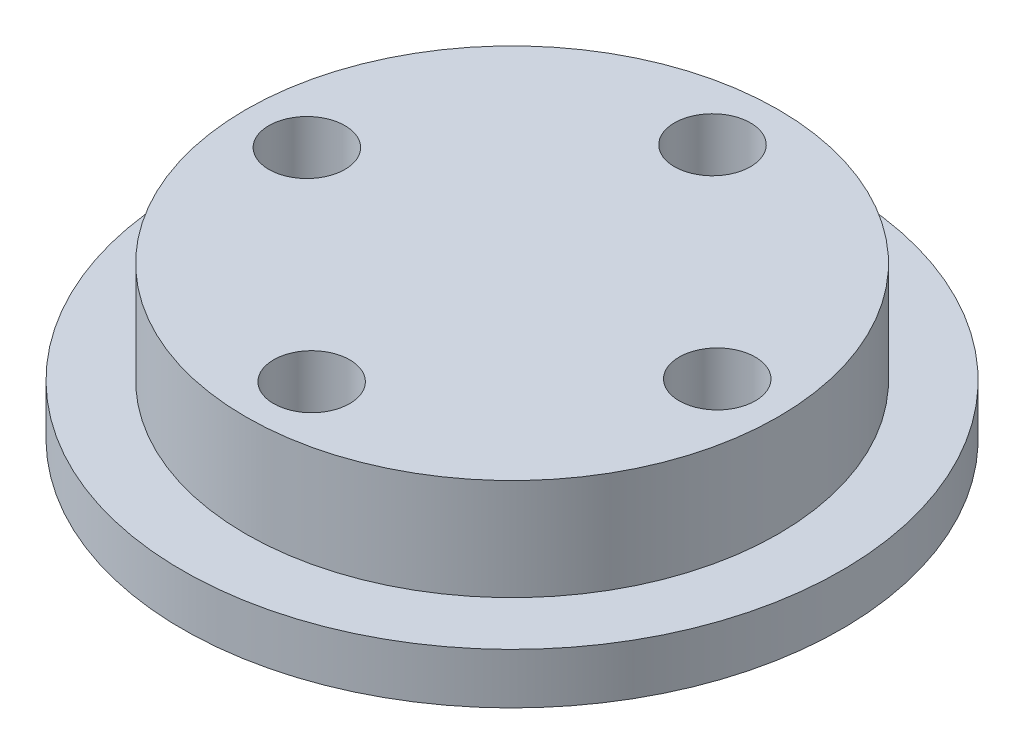
ISO-10303-21;
HEADER;
FILE_DESCRIPTION(('STEP AP214'),'2;1');
FILE_NAME('part.step','',(''),(''),'','','');
FILE_SCHEMA(('AUTOMOTIVE_DESIGN { 1 0 10303 214 1 1 1 1 }'));
ENDSEC;
DATA;
#1=APPLICATION_CONTEXT('core data for automotive mechanical design processes');
#2=APPLICATION_PROTOCOL_DEFINITION('international standard','automotive_design',2000,#1);
#3=PRODUCT_CONTEXT('',#1,'mechanical');
#4=PRODUCT('Part','Part','',(#3));
#5=PRODUCT_RELATED_PRODUCT_CATEGORY('part','',(#4));
#6=PRODUCT_DEFINITION_FORMATION('','',#4);
#7=PRODUCT_DEFINITION_CONTEXT('part definition',#1,'design');
#8=PRODUCT_DEFINITION('design','',#6,#7);
#9=PRODUCT_DEFINITION_SHAPE('','',#8);
#10=(LENGTH_UNIT() NAMED_UNIT(*) SI_UNIT(.MILLI.,.METRE.));
#11=(NAMED_UNIT(*) PLANE_ANGLE_UNIT() SI_UNIT($,.RADIAN.));
#12=(NAMED_UNIT(*) SI_UNIT($,.STERADIAN.) SOLID_ANGLE_UNIT());
#13=UNCERTAINTY_MEASURE_WITH_UNIT(LENGTH_MEASURE(1.E-05),#10,'distance_accuracy_value','');
#14=(GEOMETRIC_REPRESENTATION_CONTEXT(3) GLOBAL_UNCERTAINTY_ASSIGNED_CONTEXT((#13)) GLOBAL_UNIT_ASSIGNED_CONTEXT((#10,
#11,#12)) REPRESENTATION_CONTEXT('',''));
#15=CARTESIAN_POINT('',(0.,0.,0.));
#16=DIRECTION('',(0.,0.,1.));
#17=DIRECTION('',(1.,0.,0.));
#18=AXIS2_PLACEMENT_3D('',#15,#16,#17);
#19=CARTESIAN_POINT('',(0.,4.,0.));
#20=DIRECTION('',(0.,-1.,0.));
#21=DIRECTION('',(0.,0.,-1.));
#22=AXIS2_PLACEMENT_3D('',#19,#20,#21);
#23=CYLINDRICAL_SURFACE('',#22,10.5);
#24=CARTESIAN_POINT('',(0.,4.,0.));
#25=DIRECTION('',(0.,1.,0.));
#26=DIRECTION('',(0.,0.,1.));
#27=AXIS2_PLACEMENT_3D('',#24,#25,#26);
#28=CIRCLE('',#27,10.5);
#29=CARTESIAN_POINT('',(0.,4.,10.5));
#30=VERTEX_POINT('',#29);
#31=EDGE_CURVE('E10',#30,#30,#28,.T.);
#32=ORIENTED_EDGE('',*,*,#31,.F.);
#33=EDGE_LOOP('',(#32));
#34=FACE_BOUND('',#33,.T.);
#35=CARTESIAN_POINT('',(0.,0.,0.));
#36=DIRECTION('',(0.,-1.,0.));
#37=DIRECTION('',(0.,0.,-1.));
#38=AXIS2_PLACEMENT_3D('',#35,#36,#37);
#39=CIRCLE('',#38,10.5);
#40=CARTESIAN_POINT('',(0.,0.,-10.5));
#41=VERTEX_POINT('',#40);
#42=EDGE_CURVE('E41',#41,#41,#39,.T.);
#43=ORIENTED_EDGE('',*,*,#42,.F.);
#44=EDGE_LOOP('',(#43));
#45=FACE_BOUND('',#44,.T.);
#46=ADVANCED_FACE('F35',(#34,#45),#23,.T.);
#47=CARTESIAN_POINT('',(0.,4.,0.));
#48=DIRECTION('',(0.,1.,0.));
#49=DIRECTION('',(0.,0.,1.));
#50=AXIS2_PLACEMENT_3D('',#47,#48,#49);
#51=PLANE('',#50);
#52=CARTESIAN_POINT('',(7.99944720738013,4.,-0.0940445444378522));
#53=DIRECTION('',(0.,1.,0.));
#54=DIRECTION('',(0.,0.,1.));
#55=AXIS2_PLACEMENT_3D('',#52,#53,#54);
#56=CIRCLE('',#55,1.49999999986292);
#57=CARTESIAN_POINT('',(7.99944720738013,4.,1.40595545542506));
#58=VERTEX_POINT('',#57);
#59=EDGE_CURVE('E73',#58,#58,#56,.T.);
#60=ORIENTED_EDGE('',*,*,#59,.F.);
#61=EDGE_LOOP('',(#60));
#62=FACE_BOUND('',#61,.T.);
#63=CARTESIAN_POINT('',(0.0940445444663485,4.,7.99944720740785));
#64=DIRECTION('',(0.,1.,0.));
#65=DIRECTION('',(0.,0.,1.));
#66=AXIS2_PLACEMENT_3D('',#63,#64,#65);
#67=CIRCLE('',#66,1.49999999999886);
#68=CARTESIAN_POINT('',(0.0940445444663485,4.,9.49944720740672));
#69=VERTEX_POINT('',#68);
#70=EDGE_CURVE('E67',#69,#69,#67,.T.);
#71=ORIENTED_EDGE('',*,*,#70,.F.);
#72=EDGE_LOOP('',(#71));
#73=FACE_BOUND('',#72,.T.);
#74=CARTESIAN_POINT('',(-0.0940445444656633,4.,-7.99944720735171));
#75=DIRECTION('',(0.,1.,0.));
#76=DIRECTION('',(0.,0.,1.));
#77=AXIS2_PLACEMENT_3D('',#74,#75,#76);
#78=CIRCLE('',#77,1.49999999999888);
#79=CARTESIAN_POINT('',(-0.0940445444656633,4.,-6.49944720735284));
#80=VERTEX_POINT('',#79);
#81=EDGE_CURVE('E61',#80,#80,#78,.T.);
#82=ORIENTED_EDGE('',*,*,#81,.F.);
#83=EDGE_LOOP('',(#82));
#84=FACE_BOUND('',#83,.T.);
#85=CARTESIAN_POINT('',(-7.99944720737944,4.,0.0940445444940485));
#86=DIRECTION('',(0.,1.,0.));
#87=DIRECTION('',(0.,0.,1.));
#88=AXIS2_PLACEMENT_3D('',#85,#86,#87);
#89=CIRCLE('',#88,1.49999999986292);
#90=CARTESIAN_POINT('',(-7.99944720737944,4.,1.59404454435697));
#91=VERTEX_POINT('',#90);
#92=EDGE_CURVE('E55',#91,#91,#89,.T.);
#93=ORIENTED_EDGE('',*,*,#92,.F.);
#94=EDGE_LOOP('',(#93));
#95=FACE_BOUND('',#94,.T.);
#96=ORIENTED_EDGE('',*,*,#31,.T.);
#97=EDGE_LOOP('',(#96));
#98=FACE_BOUND('',#97,.T.);
#99=ADVANCED_FACE('F89',(#62,#73,#84,#95,#98),#51,.T.);
#100=CARTESIAN_POINT('',(0.,0.,0.));
#101=DIRECTION('',(0.,-1.,0.));
#102=DIRECTION('',(0.,0.,-1.));
#103=AXIS2_PLACEMENT_3D('',#100,#101,#102);
#104=PLANE('',#103);
#105=CARTESIAN_POINT('',(0.,0.,0.));
#106=DIRECTION('',(0.,-1.,0.));
#107=DIRECTION('',(0.,0.,-1.));
#108=AXIS2_PLACEMENT_3D('',#105,#106,#107);
#109=CIRCLE('',#108,13.);
#110=CARTESIAN_POINT('',(0.,0.,-13.));
#111=VERTEX_POINT('',#110);
#112=EDGE_CURVE('E49',#111,#111,#109,.T.);
#113=ORIENTED_EDGE('',*,*,#112,.F.);
#114=EDGE_LOOP('',(#113));
#115=FACE_BOUND('',#114,.T.);
#116=ORIENTED_EDGE('',*,*,#42,.T.);
#117=EDGE_LOOP('',(#116));
#118=FACE_BOUND('',#117,.T.);
#119=ADVANCED_FACE('F92',(#115,#118),#104,.F.);
#120=CARTESIAN_POINT('',(0.,-2.,0.));
#121=DIRECTION('',(0.,1.,0.));
#122=DIRECTION('',(0.,0.,1.));
#123=AXIS2_PLACEMENT_3D('',#120,#121,#122);
#124=CYLINDRICAL_SURFACE('',#123,13.);
#125=CARTESIAN_POINT('',(0.,-2.,0.));
#126=DIRECTION('',(0.,-1.,0.));
#127=DIRECTION('',(0.,0.,-1.));
#128=AXIS2_PLACEMENT_3D('',#125,#126,#127);
#129=CIRCLE('',#128,13.);
#130=CARTESIAN_POINT('',(0.,-2.,-13.));
#131=VERTEX_POINT('',#130);
#132=EDGE_CURVE('E45',#131,#131,#129,.T.);
#133=ORIENTED_EDGE('',*,*,#132,.F.);
#134=EDGE_LOOP('',(#133));
#135=FACE_BOUND('',#134,.T.);
#136=ORIENTED_EDGE('',*,*,#112,.T.);
#137=EDGE_LOOP('',(#136));
#138=FACE_BOUND('',#137,.T.);
#139=ADVANCED_FACE('F110',(#135,#138),#124,.T.);
#140=CARTESIAN_POINT('',(0.,-2.,0.));
#141=DIRECTION('',(0.,-1.,0.));
#142=DIRECTION('',(0.,0.,-1.));
#143=AXIS2_PLACEMENT_3D('',#140,#141,#142);
#144=PLANE('',#143);
#145=CARTESIAN_POINT('',(7.99944720738013,-2.,-0.0940445444378522));
#146=DIRECTION('',(0.,1.,0.));
#147=DIRECTION('',(0.,0.,1.));
#148=AXIS2_PLACEMENT_3D('',#145,#146,#147);
#149=CIRCLE('',#148,1.49999999986292);
#150=CARTESIAN_POINT('',(7.99944720738013,-2.,1.40595545542506));
#151=VERTEX_POINT('',#150);
#152=EDGE_CURVE('E70',#151,#151,#149,.T.);
#153=ORIENTED_EDGE('',*,*,#152,.T.);
#154=EDGE_LOOP('',(#153));
#155=FACE_BOUND('',#154,.T.);
#156=CARTESIAN_POINT('',(0.0940445444663485,-2.,7.99944720740785));
#157=DIRECTION('',(0.,1.,0.));
#158=DIRECTION('',(0.,0.,1.));
#159=AXIS2_PLACEMENT_3D('',#156,#157,#158);
#160=CIRCLE('',#159,1.49999999999886);
#161=CARTESIAN_POINT('',(0.0940445444663485,-2.,9.49944720740672));
#162=VERTEX_POINT('',#161);
#163=EDGE_CURVE('E64',#162,#162,#160,.T.);
#164=ORIENTED_EDGE('',*,*,#163,.T.);
#165=EDGE_LOOP('',(#164));
#166=FACE_BOUND('',#165,.T.);
#167=CARTESIAN_POINT('',(-0.0940445444656633,-2.,-7.99944720735171));
#168=DIRECTION('',(0.,1.,0.));
#169=DIRECTION('',(0.,0.,1.));
#170=AXIS2_PLACEMENT_3D('',#167,#168,#169);
#171=CIRCLE('',#170,1.49999999999888);
#172=CARTESIAN_POINT('',(-0.0940445444656633,-2.,-6.49944720735284));
#173=VERTEX_POINT('',#172);
#174=EDGE_CURVE('E58',#173,#173,#171,.T.);
#175=ORIENTED_EDGE('',*,*,#174,.T.);
#176=EDGE_LOOP('',(#175));
#177=FACE_BOUND('',#176,.T.);
#178=CARTESIAN_POINT('',(-7.99944720737944,-2.,0.0940445444940485));
#179=DIRECTION('',(0.,1.,0.));
#180=DIRECTION('',(0.,0.,1.));
#181=AXIS2_PLACEMENT_3D('',#178,#179,#180);
#182=CIRCLE('',#181,1.49999999986292);
#183=CARTESIAN_POINT('',(-7.99944720737944,-2.,1.59404454435697));
#184=VERTEX_POINT('',#183);
#185=EDGE_CURVE('E53',#184,#184,#182,.T.);
#186=ORIENTED_EDGE('',*,*,#185,.T.);
#187=EDGE_LOOP('',(#186));
#188=FACE_BOUND('',#187,.T.);
#189=ORIENTED_EDGE('',*,*,#132,.T.);
#190=EDGE_LOOP('',(#189));
#191=FACE_BOUND('',#190,.T.);
#192=ADVANCED_FACE('F79',(#155,#166,#177,#188,#191),#144,.T.);
#193=CARTESIAN_POINT('',(-7.99944720737944,-2.,0.0940445444940485));
#194=DIRECTION('',(0.,1.,0.));
#195=DIRECTION('',(0.,0.,1.));
#196=AXIS2_PLACEMENT_3D('',#193,#194,#195);
#197=CYLINDRICAL_SURFACE('',#196,1.49999999986292);
#198=ORIENTED_EDGE('',*,*,#185,.F.);
#199=EDGE_LOOP('',(#198));
#200=FACE_BOUND('',#199,.T.);
#201=ORIENTED_EDGE('',*,*,#92,.T.);
#202=EDGE_LOOP('',(#201));
#203=FACE_BOUND('',#202,.T.);
#204=ADVANCED_FACE('F99',(#200,#203),#197,.F.);
#205=CARTESIAN_POINT('',(-0.0940445444656633,-2.,-7.99944720735171));
#206=DIRECTION('',(0.,1.,0.));
#207=DIRECTION('',(0.,0.,1.));
#208=AXIS2_PLACEMENT_3D('',#205,#206,#207);
#209=CYLINDRICAL_SURFACE('',#208,1.49999999999888);
#210=ORIENTED_EDGE('',*,*,#174,.F.);
#211=EDGE_LOOP('',(#210));
#212=FACE_BOUND('',#211,.T.);
#213=ORIENTED_EDGE('',*,*,#81,.T.);
#214=EDGE_LOOP('',(#213));
#215=FACE_BOUND('',#214,.T.);
#216=ADVANCED_FACE('F101',(#212,#215),#209,.F.);
#217=CARTESIAN_POINT('',(0.0940445444663485,-2.,7.99944720740785));
#218=DIRECTION('',(0.,1.,0.));
#219=DIRECTION('',(0.,0.,1.));
#220=AXIS2_PLACEMENT_3D('',#217,#218,#219);
#221=CYLINDRICAL_SURFACE('',#220,1.49999999999886);
#222=ORIENTED_EDGE('',*,*,#163,.F.);
#223=EDGE_LOOP('',(#222));
#224=FACE_BOUND('',#223,.T.);
#225=ORIENTED_EDGE('',*,*,#70,.T.);
#226=EDGE_LOOP('',(#225));
#227=FACE_BOUND('',#226,.T.);
#228=ADVANCED_FACE('F85',(#224,#227),#221,.F.);
#229=CARTESIAN_POINT('',(7.99944720738013,-2.,-0.0940445444378522));
#230=DIRECTION('',(0.,1.,0.));
#231=DIRECTION('',(0.,0.,1.));
#232=AXIS2_PLACEMENT_3D('',#229,#230,#231);
#233=CYLINDRICAL_SURFACE('',#232,1.49999999986292);
#234=ORIENTED_EDGE('',*,*,#152,.F.);
#235=EDGE_LOOP('',(#234));
#236=FACE_BOUND('',#235,.T.);
#237=ORIENTED_EDGE('',*,*,#59,.T.);
#238=EDGE_LOOP('',(#237));
#239=FACE_BOUND('',#238,.T.);
#240=ADVANCED_FACE('F82',(#236,#239),#233,.F.);
#241=CLOSED_SHELL('',(#46,#99,#119,#139,#192,#204,#216,#228,#240));
#242=MANIFOLD_SOLID_BREP('B2',#241);
#243=ADVANCED_BREP_SHAPE_REPRESENTATION('',(#18,#242),#14);
#244=SHAPE_DEFINITION_REPRESENTATION(#9,#243);
ENDSEC;
END-ISO-10303-21;
